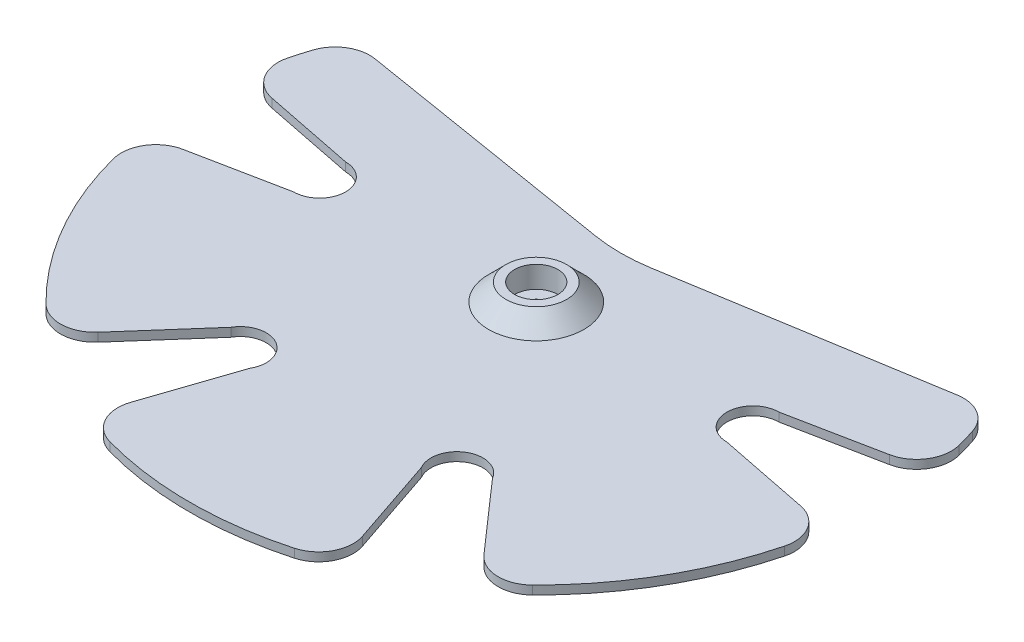
ISO-10303-21;
HEADER;
FILE_DESCRIPTION(('STEP AP214'),'2;1');
FILE_NAME('part.step','',(''),(''),'','','');
FILE_SCHEMA(('AUTOMOTIVE_DESIGN { 1 0 10303 214 1 1 1 1 }'));
ENDSEC;
DATA;
#1=APPLICATION_CONTEXT('core data for automotive mechanical design processes');
#2=APPLICATION_PROTOCOL_DEFINITION('international standard','automotive_design',2000,#1);
#3=PRODUCT_CONTEXT('',#1,'mechanical');
#4=PRODUCT('Part','Part','',(#3));
#5=PRODUCT_RELATED_PRODUCT_CATEGORY('part','',(#4));
#6=PRODUCT_DEFINITION_FORMATION('','',#4);
#7=PRODUCT_DEFINITION_CONTEXT('part definition',#1,'design');
#8=PRODUCT_DEFINITION('design','',#6,#7);
#9=PRODUCT_DEFINITION_SHAPE('','',#8);
#10=(LENGTH_UNIT() NAMED_UNIT(*) SI_UNIT(.MILLI.,.METRE.));
#11=(NAMED_UNIT(*) PLANE_ANGLE_UNIT() SI_UNIT($,.RADIAN.));
#12=(NAMED_UNIT(*) SI_UNIT($,.STERADIAN.) SOLID_ANGLE_UNIT());
#13=UNCERTAINTY_MEASURE_WITH_UNIT(LENGTH_MEASURE(1.E-05),#10,'distance_accuracy_value','');
#14=(GEOMETRIC_REPRESENTATION_CONTEXT(3) GLOBAL_UNCERTAINTY_ASSIGNED_CONTEXT((#13)) GLOBAL_UNIT_ASSIGNED_CONTEXT((#10,
#11,#12)) REPRESENTATION_CONTEXT('',''));
#15=CARTESIAN_POINT('',(0.,0.,0.));
#16=DIRECTION('',(0.,0.,1.));
#17=DIRECTION('',(1.,0.,0.));
#18=AXIS2_PLACEMENT_3D('',#15,#16,#17);
#19=CARTESIAN_POINT('',(0.,-2.,-29.7612520866625));
#20=DIRECTION('',(0.,1.,0.));
#21=DIRECTION('',(0.,0.,1.));
#22=AXIS2_PLACEMENT_3D('',#19,#20,#21);
#23=CYLINDRICAL_SURFACE('',#22,20.);
#24=DIRECTION('',(0.,-1.,0.));
#25=VECTOR('',#24,1.);
#26=CARTESIAN_POINT('',(-3.23120398234031,-2.,-10.0239949108412));
#27=LINE('',#26,#25);
#28=CARTESIAN_POINT('',(-3.23120398234031,1.,-10.0239949108412));
#29=VERTEX_POINT('',#28);
#30=CARTESIAN_POINT('',(-3.2312039823403,0.,-10.0239949108412));
#31=VERTEX_POINT('',#30);
#32=EDGE_CURVE('E464',#29,#31,#27,.T.);
#33=ORIENTED_EDGE('',*,*,#32,.F.);
#34=CARTESIAN_POINT('',(0.,1.,-29.7612520866625));
#35=DIRECTION('',(0.,1.,0.));
#36=DIRECTION('',(0.,0.,1.));
#37=AXIS2_PLACEMENT_3D('',#34,#35,#36);
#38=CIRCLE('',#37,20.);
#39=CARTESIAN_POINT('',(3.23120398234029,1.,-10.0239949108412));
#40=VERTEX_POINT('',#39);
#41=EDGE_CURVE('E55',#29,#40,#38,.T.);
#42=ORIENTED_EDGE('',*,*,#41,.T.);
#43=DIRECTION('',(0.,-1.,0.));
#44=VECTOR('',#43,1.);
#45=CARTESIAN_POINT('',(3.23120398234028,-2.,-10.0239949108412));
#46=LINE('',#45,#44);
#47=CARTESIAN_POINT('',(3.23120398234028,0.,-10.0239949108412));
#48=VERTEX_POINT('',#47);
#49=EDGE_CURVE('E467',#48,#40,#46,.F.);
#50=ORIENTED_EDGE('',*,*,#49,.F.);
#51=CARTESIAN_POINT('',(0.,0.,-29.7612520866625));
#52=DIRECTION('',(0.,1.,0.));
#53=DIRECTION('',(0.,0.,1.));
#54=AXIS2_PLACEMENT_3D('',#51,#52,#53);
#55=CIRCLE('',#54,20.);
#56=EDGE_CURVE('E12',#48,#31,#55,.F.);
#57=ORIENTED_EDGE('',*,*,#56,.T.);
#58=EDGE_LOOP('',(#33,#42,#50,#57));
#59=FACE_BOUND('',#58,.T.);
#60=ADVANCED_FACE('F48',(#59),#23,.F.);
#61=CARTESIAN_POINT('',(34.8443966505238,1.,-9.04809494097898));
#62=DIRECTION('',(0.,-1.,0.));
#63=DIRECTION('',(0.,0.,-1.));
#64=AXIS2_PLACEMENT_3D('',#61,#62,#63);
#65=CYLINDRICAL_SURFACE('',#64,4.);
#66=DIRECTION('',(0.,1.,0.));
#67=VECTOR('',#66,1.);
#68=CARTESIAN_POINT('',(35.6288611910765,1.,-5.1257722382153));
#69=LINE('',#68,#67);
#70=CARTESIAN_POINT('',(35.6288611910765,0.,-5.1257722382153));
#71=VERTEX_POINT('',#70);
#72=CARTESIAN_POINT('',(35.6288611910765,1.,-5.1257722382153));
#73=VERTEX_POINT('',#72);
#74=EDGE_CURVE('E454',#71,#73,#69,.T.);
#75=ORIENTED_EDGE('',*,*,#74,.F.);
#76=CARTESIAN_POINT('',(34.8443966505238,0.,-9.04809494097898));
#77=DIRECTION('',(0.,1.,0.));
#78=DIRECTION('',(0.,0.,1.));
#79=AXIS2_PLACEMENT_3D('',#76,#77,#78);
#80=CIRCLE('',#79,4.);
#81=CARTESIAN_POINT('',(38.7159962783597,0.,-10.05343882331));
#82=VERTEX_POINT('',#81);
#83=EDGE_CURVE('E460',#82,#71,#80,.F.);
#84=ORIENTED_EDGE('',*,*,#83,.F.);
#85=DIRECTION('',(0.,-1.,0.));
#86=VECTOR('',#85,1.);
#87=CARTESIAN_POINT('',(38.7159962783597,1.,-10.05343882331));
#88=LINE('',#87,#86);
#89=CARTESIAN_POINT('',(38.7159962783597,1.,-10.05343882331));
#90=VERTEX_POINT('',#89);
#91=EDGE_CURVE('E457',#90,#82,#88,.T.);
#92=ORIENTED_EDGE('',*,*,#91,.F.);
#93=CARTESIAN_POINT('',(34.8443966505238,1.,-9.04809494097898));
#94=DIRECTION('',(0.,1.,0.));
#95=DIRECTION('',(0.,0.,1.));
#96=AXIS2_PLACEMENT_3D('',#93,#94,#95);
#97=CIRCLE('',#96,4.);
#98=EDGE_CURVE('E462',#73,#90,#97,.T.);
#99=ORIENTED_EDGE('',*,*,#98,.F.);
#100=EDGE_LOOP('',(#75,#84,#92,#99));
#101=FACE_BOUND('',#100,.T.);
#102=ADVANCED_FACE('F512',(#101),#65,.T.);
#103=CARTESIAN_POINT('',(34.8443966505238,1.,9.04809494097898));
#104=DIRECTION('',(0.,-1.,0.));
#105=DIRECTION('',(0.,0.,-1.));
#106=AXIS2_PLACEMENT_3D('',#103,#104,#105);
#107=CYLINDRICAL_SURFACE('',#106,4.);
#108=DIRECTION('',(0.,-1.,0.));
#109=VECTOR('',#108,1.);
#110=CARTESIAN_POINT('',(35.6288611910765,-9.,5.1257722382153));
#111=LINE('',#110,#109);
#112=CARTESIAN_POINT('',(35.6288611910765,1.,5.1257722382153));
#113=VERTEX_POINT('',#112);
#114=CARTESIAN_POINT('',(35.6288611910765,0.,5.1257722382153));
#115=VERTEX_POINT('',#114);
#116=EDGE_CURVE('E444',#113,#115,#111,.T.);
#117=ORIENTED_EDGE('',*,*,#116,.F.);
#118=CARTESIAN_POINT('',(34.8443966505238,1.,9.04809494097898));
#119=DIRECTION('',(0.,1.,0.));
#120=DIRECTION('',(0.,0.,1.));
#121=AXIS2_PLACEMENT_3D('',#118,#119,#120);
#122=CIRCLE('',#121,4.);
#123=CARTESIAN_POINT('',(38.7159962783597,1.,10.05343882331));
#124=VERTEX_POINT('',#123);
#125=EDGE_CURVE('E450',#124,#113,#122,.T.);
#126=ORIENTED_EDGE('',*,*,#125,.F.);
#127=DIRECTION('',(0.,-1.,0.));
#128=VECTOR('',#127,1.);
#129=CARTESIAN_POINT('',(38.7159962783597,1.,10.05343882331));
#130=LINE('',#129,#128);
#131=CARTESIAN_POINT('',(38.7159962783597,0.,10.05343882331));
#132=VERTEX_POINT('',#131);
#133=EDGE_CURVE('E447',#132,#124,#130,.F.);
#134=ORIENTED_EDGE('',*,*,#133,.F.);
#135=CARTESIAN_POINT('',(34.8443966505238,0.,9.04809494097898));
#136=DIRECTION('',(0.,1.,0.));
#137=DIRECTION('',(0.,0.,1.));
#138=AXIS2_PLACEMENT_3D('',#135,#136,#137);
#139=CIRCLE('',#138,4.);
#140=EDGE_CURVE('E452',#115,#132,#139,.F.);
#141=ORIENTED_EDGE('',*,*,#140,.F.);
#142=EDGE_LOOP('',(#117,#126,#134,#141));
#143=FACE_BOUND('',#142,.T.);
#144=ADVANCED_FACE('F516',(#143),#107,.T.);
#145=CARTESIAN_POINT('',(25.2580784000031,1.,25.6520852084056));
#146=DIRECTION('',(0.,-1.,0.));
#147=DIRECTION('',(0.,0.,-1.));
#148=AXIS2_PLACEMENT_3D('',#145,#146,#147);
#149=CYLINDRICAL_SURFACE('',#148,4.);
#150=DIRECTION('',(0.,1.,0.));
#151=VECTOR('',#150,1.);
#152=CARTESIAN_POINT('',(22.2534795678455,1.,28.292612780274));
#153=LINE('',#152,#151);
#154=CARTESIAN_POINT('',(22.2534795678451,0.,28.2926127802736));
#155=VERTEX_POINT('',#154);
#156=CARTESIAN_POINT('',(22.2534795678451,1.,28.2926127802736));
#157=VERTEX_POINT('',#156);
#158=EDGE_CURVE('E434',#155,#157,#153,.T.);
#159=ORIENTED_EDGE('',*,*,#158,.F.);
#160=CARTESIAN_POINT('',(25.2580784000031,0.,25.6520852084056));
#161=DIRECTION('',(0.,1.,0.));
#162=DIRECTION('',(0.,0.,1.));
#163=AXIS2_PLACEMENT_3D('',#160,#161,#162);
#164=CIRCLE('',#163,4.);
#165=CARTESIAN_POINT('',(28.064531555559,0.,28.5023168982284));
#166=VERTEX_POINT('',#165);
#167=EDGE_CURVE('E440',#166,#155,#164,.F.);
#168=ORIENTED_EDGE('',*,*,#167,.F.);
#169=DIRECTION('',(0.,-1.,0.));
#170=VECTOR('',#169,1.);
#171=CARTESIAN_POINT('',(28.064531555559,1.,28.5023168982284));
#172=LINE('',#171,#170);
#173=CARTESIAN_POINT('',(28.064531555559,1.,28.5023168982284));
#174=VERTEX_POINT('',#173);
#175=EDGE_CURVE('E437',#174,#166,#172,.T.);
#176=ORIENTED_EDGE('',*,*,#175,.F.);
#177=CARTESIAN_POINT('',(25.2580784000031,1.,25.6520852084056));
#178=DIRECTION('',(0.,1.,0.));
#179=DIRECTION('',(0.,0.,1.));
#180=AXIS2_PLACEMENT_3D('',#177,#178,#179);
#181=CIRCLE('',#180,4.);
#182=EDGE_CURVE('E442',#157,#174,#181,.T.);
#183=ORIENTED_EDGE('',*,*,#182,.F.);
#184=EDGE_LOOP('',(#159,#168,#176,#183));
#185=FACE_BOUND('',#184,.T.);
#186=ADVANCED_FACE('F680',(#185),#149,.T.);
#187=CARTESIAN_POINT('',(9.58631825052174,1.,34.7001801493842));
#188=DIRECTION('',(0.,-1.,0.));
#189=DIRECTION('',(0.,0.,-1.));
#190=AXIS2_PLACEMENT_3D('',#187,#188,#189);
#191=CYLINDRICAL_SURFACE('',#190,4.);
#192=DIRECTION('',(0.,-1.,0.));
#193=VECTOR('',#192,1.);
#194=CARTESIAN_POINT('',(13.3753816232319,-9.,33.4183850184892));
#195=LINE('',#194,#193);
#196=CARTESIAN_POINT('',(13.3753816232319,1.,33.4183850184892));
#197=VERTEX_POINT('',#196);
#198=CARTESIAN_POINT('',(13.3753816232319,0.,33.4183850184892));
#199=VERTEX_POINT('',#198);
#200=EDGE_CURVE('E426',#197,#199,#195,.T.);
#201=ORIENTED_EDGE('',*,*,#200,.F.);
#202=CARTESIAN_POINT('',(9.58631825052174,1.,34.7001801493842));
#203=DIRECTION('',(0.,1.,0.));
#204=DIRECTION('',(0.,0.,1.));
#205=AXIS2_PLACEMENT_3D('',#202,#203,#204);
#206=CIRCLE('',#205,4.);
#207=CARTESIAN_POINT('',(10.6514647228019,1.,38.5557557215379));
#208=VERTEX_POINT('',#207);
#209=EDGE_CURVE('E267',#208,#197,#206,.T.);
#210=ORIENTED_EDGE('',*,*,#209,.F.);
#211=DIRECTION('',(0.,-1.,0.));
#212=VECTOR('',#211,1.);
#213=CARTESIAN_POINT('',(10.6514647228019,1.,38.5557557215379));
#214=LINE('',#213,#212);
#215=CARTESIAN_POINT('',(10.6514647228019,0.,38.5557557215379));
#216=VERTEX_POINT('',#215);
#217=EDGE_CURVE('E428',#216,#208,#214,.F.);
#218=ORIENTED_EDGE('',*,*,#217,.F.);
#219=CARTESIAN_POINT('',(9.58631825052174,0.,34.7001801493842));
#220=DIRECTION('',(0.,1.,0.));
#221=DIRECTION('',(0.,0.,1.));
#222=AXIS2_PLACEMENT_3D('',#219,#220,#221);
#223=CIRCLE('',#222,4.);
#224=EDGE_CURVE('E432',#199,#216,#223,.F.);
#225=ORIENTED_EDGE('',*,*,#224,.F.);
#226=EDGE_LOOP('',(#201,#210,#218,#225));
#227=FACE_BOUND('',#226,.T.);
#228=ADVANCED_FACE('F676',(#227),#191,.T.);
#229=CARTESIAN_POINT('',(-9.58631825051854,1.,34.700180149385));
#230=DIRECTION('',(0.,-1.,0.));
#231=DIRECTION('',(0.,0.,-1.));
#232=AXIS2_PLACEMENT_3D('',#229,#230,#231);
#233=CYLINDRICAL_SURFACE('',#232,4.);
#234=DIRECTION('',(0.,1.,0.));
#235=VECTOR('',#234,1.);
#236=CARTESIAN_POINT('',(-13.3753816232286,1.,33.4183850184896));
#237=LINE('',#236,#235);
#238=CARTESIAN_POINT('',(-13.3753816232286,0.,33.4183850184896));
#239=VERTEX_POINT('',#238);
#240=CARTESIAN_POINT('',(-13.3753816232286,1.,33.4183850184896));
#241=VERTEX_POINT('',#240);
#242=EDGE_CURVE('E416',#239,#241,#237,.T.);
#243=ORIENTED_EDGE('',*,*,#242,.F.);
#244=CARTESIAN_POINT('',(-9.58631825051854,0.,34.700180149385));
#245=DIRECTION('',(0.,1.,0.));
#246=DIRECTION('',(0.,0.,1.));
#247=AXIS2_PLACEMENT_3D('',#244,#245,#246);
#248=CIRCLE('',#247,4.);
#249=CARTESIAN_POINT('',(-10.6514647227984,0.,38.5557557215389));
#250=VERTEX_POINT('',#249);
#251=EDGE_CURVE('E422',#250,#239,#248,.F.);
#252=ORIENTED_EDGE('',*,*,#251,.F.);
#253=DIRECTION('',(0.,-1.,0.));
#254=VECTOR('',#253,1.);
#255=CARTESIAN_POINT('',(-10.6514647227984,1.,38.5557557215389));
#256=LINE('',#255,#254);
#257=CARTESIAN_POINT('',(-10.6514647227984,1.,38.5557557215389));
#258=VERTEX_POINT('',#257);
#259=EDGE_CURVE('E419',#258,#250,#256,.T.);
#260=ORIENTED_EDGE('',*,*,#259,.F.);
#261=CARTESIAN_POINT('',(-9.58631825051854,1.,34.700180149385));
#262=DIRECTION('',(0.,1.,0.));
#263=DIRECTION('',(0.,0.,1.));
#264=AXIS2_PLACEMENT_3D('',#261,#262,#263);
#265=CIRCLE('',#264,4.);
#266=EDGE_CURVE('E424',#241,#258,#265,.T.);
#267=ORIENTED_EDGE('',*,*,#266,.F.);
#268=EDGE_LOOP('',(#243,#252,#260,#267));
#269=FACE_BOUND('',#268,.T.);
#270=ADVANCED_FACE('F669',(#269),#233,.T.);
#271=CARTESIAN_POINT('',(-25.2580784000008,1.,25.6520852084078));
#272=DIRECTION('',(0.,-1.,0.));
#273=DIRECTION('',(0.,0.,-1.));
#274=AXIS2_PLACEMENT_3D('',#271,#272,#273);
#275=CYLINDRICAL_SURFACE('',#274,4.);
#276=DIRECTION('',(0.,-1.,0.));
#277=VECTOR('',#276,1.);
#278=CARTESIAN_POINT('',(-28.0645315555564,1.,28.5023168982309));
#279=LINE('',#278,#277);
#280=CARTESIAN_POINT('',(-28.0645315555564,0.,28.5023168982309));
#281=VERTEX_POINT('',#280);
#282=CARTESIAN_POINT('',(-28.0645315555564,1.,28.5023168982309));
#283=VERTEX_POINT('',#282);
#284=EDGE_CURVE('E406',#281,#283,#279,.F.);
#285=ORIENTED_EDGE('',*,*,#284,.F.);
#286=CARTESIAN_POINT('',(-25.2580784000008,0.,25.6520852084078));
#287=DIRECTION('',(0.,1.,0.));
#288=DIRECTION('',(0.,0.,1.));
#289=AXIS2_PLACEMENT_3D('',#286,#287,#288);
#290=CIRCLE('',#289,4.);
#291=CARTESIAN_POINT('',(-22.2534795678436,0.,28.2926127802767));
#292=VERTEX_POINT('',#291);
#293=EDGE_CURVE('E412',#292,#281,#290,.F.);
#294=ORIENTED_EDGE('',*,*,#293,.F.);
#295=DIRECTION('',(0.,-1.,0.));
#296=VECTOR('',#295,1.);
#297=CARTESIAN_POINT('',(-22.2534795678436,-9.,28.2926127802767));
#298=LINE('',#297,#296);
#299=CARTESIAN_POINT('',(-22.2534795678436,1.,28.2926127802767));
#300=VERTEX_POINT('',#299);
#301=EDGE_CURVE('E409',#300,#292,#298,.T.);
#302=ORIENTED_EDGE('',*,*,#301,.F.);
#303=CARTESIAN_POINT('',(-25.2580784000008,1.,25.6520852084078));
#304=DIRECTION('',(0.,1.,0.));
#305=DIRECTION('',(0.,0.,1.));
#306=AXIS2_PLACEMENT_3D('',#303,#304,#305);
#307=CIRCLE('',#306,4.);
#308=EDGE_CURVE('E414',#283,#300,#307,.T.);
#309=ORIENTED_EDGE('',*,*,#308,.F.);
#310=EDGE_LOOP('',(#285,#294,#302,#309));
#311=FACE_BOUND('',#310,.T.);
#312=ADVANCED_FACE('F662',(#311),#275,.T.);
#313=CARTESIAN_POINT('',(-34.844396650523,1.,9.04809494098188));
#314=DIRECTION('',(0.,-1.,0.));
#315=DIRECTION('',(0.,0.,-1.));
#316=AXIS2_PLACEMENT_3D('',#313,#314,#315);
#317=CYLINDRICAL_SURFACE('',#316,4.);
#318=DIRECTION('',(0.,1.,0.));
#319=VECTOR('',#318,1.);
#320=CARTESIAN_POINT('',(-35.6288611910752,1.,5.1257722382181));
#321=LINE('',#320,#319);
#322=CARTESIAN_POINT('',(-35.6288611910753,0.,5.1257722382181));
#323=VERTEX_POINT('',#322);
#324=CARTESIAN_POINT('',(-35.6288611910752,1.,5.1257722382181));
#325=VERTEX_POINT('',#324);
#326=EDGE_CURVE('E396',#323,#325,#321,.T.);
#327=ORIENTED_EDGE('',*,*,#326,.F.);
#328=CARTESIAN_POINT('',(-34.844396650523,0.,9.04809494098188));
#329=DIRECTION('',(0.,1.,0.));
#330=DIRECTION('',(0.,0.,1.));
#331=AXIS2_PLACEMENT_3D('',#328,#329,#330);
#332=CIRCLE('',#331,4.);
#333=CARTESIAN_POINT('',(-38.7159962783589,0.,10.0534388233132));
#334=VERTEX_POINT('',#333);
#335=EDGE_CURVE('E402',#334,#323,#332,.F.);
#336=ORIENTED_EDGE('',*,*,#335,.F.);
#337=DIRECTION('',(0.,-1.,0.));
#338=VECTOR('',#337,1.);
#339=CARTESIAN_POINT('',(-38.7159962783589,1.,10.0534388233132));
#340=LINE('',#339,#338);
#341=CARTESIAN_POINT('',(-38.7159962783589,1.,10.0534388233132));
#342=VERTEX_POINT('',#341);
#343=EDGE_CURVE('E399',#342,#334,#340,.T.);
#344=ORIENTED_EDGE('',*,*,#343,.F.);
#345=CARTESIAN_POINT('',(-34.844396650523,1.,9.04809494098188));
#346=DIRECTION('',(0.,1.,0.));
#347=DIRECTION('',(0.,0.,1.));
#348=AXIS2_PLACEMENT_3D('',#345,#346,#347);
#349=CIRCLE('',#348,4.);
#350=EDGE_CURVE('E404',#325,#342,#349,.T.);
#351=ORIENTED_EDGE('',*,*,#350,.F.);
#352=EDGE_LOOP('',(#327,#336,#344,#351));
#353=FACE_BOUND('',#352,.T.);
#354=ADVANCED_FACE('F660',(#353),#317,.T.);
#355=CARTESIAN_POINT('',(-34.8443966505245,1.,-9.04809494097625));
#356=DIRECTION('',(0.,-1.,0.));
#357=DIRECTION('',(0.,0.,-1.));
#358=AXIS2_PLACEMENT_3D('',#355,#356,#357);
#359=CYLINDRICAL_SURFACE('',#358,4.);
#360=DIRECTION('',(0.,-1.,0.));
#361=VECTOR('',#360,1.);
#362=CARTESIAN_POINT('',(-38.7159962783605,1.,-10.0534388233069));
#363=LINE('',#362,#361);
#364=CARTESIAN_POINT('',(-38.7159962783605,0.,-10.053438823307));
#365=VERTEX_POINT('',#364);
#366=CARTESIAN_POINT('',(-38.7159962783605,1.,-10.053438823307));
#367=VERTEX_POINT('',#366);
#368=EDGE_CURVE('E386',#365,#367,#363,.F.);
#369=ORIENTED_EDGE('',*,*,#368,.F.);
#370=CARTESIAN_POINT('',(-34.8443966505245,0.,-9.04809494097625));
#371=DIRECTION('',(0.,1.,0.));
#372=DIRECTION('',(0.,0.,1.));
#373=AXIS2_PLACEMENT_3D('',#370,#371,#372);
#374=CIRCLE('',#373,4.);
#375=CARTESIAN_POINT('',(-35.6288611910777,0.,-5.12577223821266));
#376=VERTEX_POINT('',#375);
#377=EDGE_CURVE('E392',#376,#365,#374,.F.);
#378=ORIENTED_EDGE('',*,*,#377,.F.);
#379=DIRECTION('',(0.,-1.,0.));
#380=VECTOR('',#379,1.);
#381=CARTESIAN_POINT('',(-35.6288611910777,-9.,-5.12577223821266));
#382=LINE('',#381,#380);
#383=CARTESIAN_POINT('',(-35.6288611910771,1.,-5.12577223821255));
#384=VERTEX_POINT('',#383);
#385=EDGE_CURVE('E389',#384,#376,#382,.T.);
#386=ORIENTED_EDGE('',*,*,#385,.F.);
#387=CARTESIAN_POINT('',(-34.8443966505245,1.,-9.04809494097625));
#388=DIRECTION('',(0.,1.,0.));
#389=DIRECTION('',(0.,0.,1.));
#390=AXIS2_PLACEMENT_3D('',#387,#388,#389);
#391=CIRCLE('',#390,4.);
#392=EDGE_CURVE('E394',#367,#384,#391,.T.);
#393=ORIENTED_EDGE('',*,*,#392,.F.);
#394=EDGE_LOOP('',(#369,#378,#386,#393));
#395=FACE_BOUND('',#394,.T.);
#396=ADVANCED_FACE('F652',(#395),#359,.T.);
#397=CARTESIAN_POINT('',(-34.2619251207725,1.,-11.0508138622718));
#398=DIRECTION('',(0.,-1.,0.));
#399=DIRECTION('',(0.,0.,-1.));
#400=AXIS2_PLACEMENT_3D('',#397,#398,#399);
#401=CYLINDRICAL_SURFACE('',#400,4.);
#402=DIRECTION('',(0.,-1.,0.));
#403=VECTOR('',#402,1.);
#404=CARTESIAN_POINT('',(-33.6156843243044,-2.,-14.9982652974361));
#405=LINE('',#404,#403);
#406=CARTESIAN_POINT('',(-33.6156843243044,0.,-14.9982652974361));
#407=VERTEX_POINT('',#406);
#408=CARTESIAN_POINT('',(-33.6156843243044,1.,-14.9982652974361));
#409=VERTEX_POINT('',#408);
#410=EDGE_CURVE('E376',#407,#409,#405,.F.);
#411=ORIENTED_EDGE('',*,*,#410,.F.);
#412=CARTESIAN_POINT('',(-34.2619251207725,0.,-11.0508138622718));
#413=DIRECTION('',(0.,1.,0.));
#414=DIRECTION('',(0.,0.,1.));
#415=AXIS2_PLACEMENT_3D('',#412,#413,#414);
#416=CIRCLE('',#415,4.);
#417=CARTESIAN_POINT('',(-38.0688056897472,0.,-12.2786820691909));
#418=VERTEX_POINT('',#417);
#419=EDGE_CURVE('E382',#418,#407,#416,.F.);
#420=ORIENTED_EDGE('',*,*,#419,.F.);
#421=DIRECTION('',(0.,-1.,0.));
#422=VECTOR('',#421,1.);
#423=CARTESIAN_POINT('',(-38.0688056897472,1.,-12.2786820691909));
#424=LINE('',#423,#422);
#425=CARTESIAN_POINT('',(-38.0688056897472,1.,-12.2786820691909));
#426=VERTEX_POINT('',#425);
#427=EDGE_CURVE('E379',#426,#418,#424,.T.);
#428=ORIENTED_EDGE('',*,*,#427,.F.);
#429=CARTESIAN_POINT('',(-34.2619251207725,1.,-11.0508138622718));
#430=DIRECTION('',(0.,1.,0.));
#431=DIRECTION('',(0.,0.,1.));
#432=AXIS2_PLACEMENT_3D('',#429,#430,#431);
#433=CIRCLE('',#432,4.);
#434=EDGE_CURVE('E384',#409,#426,#433,.T.);
#435=ORIENTED_EDGE('',*,*,#434,.F.);
#436=EDGE_LOOP('',(#411,#420,#428,#435));
#437=FACE_BOUND('',#436,.T.);
#438=ADVANCED_FACE('F525',(#437),#401,.T.);
#439=CARTESIAN_POINT('',(34.2619251207725,1.,-11.0508138622718));
#440=DIRECTION('',(0.,-1.,0.));
#441=DIRECTION('',(0.,0.,-1.));
#442=AXIS2_PLACEMENT_3D('',#439,#440,#441);
#443=CYLINDRICAL_SURFACE('',#442,4.);
#444=DIRECTION('',(0.,-1.,0.));
#445=VECTOR('',#444,1.);
#446=CARTESIAN_POINT('',(33.6156843243044,-2.,-14.9982652974361));
#447=LINE('',#446,#445);
#448=CARTESIAN_POINT('',(33.6156843243044,1.,-14.9982652974361));
#449=VERTEX_POINT('',#448);
#450=CARTESIAN_POINT('',(33.6156843243044,0.,-14.9982652974361));
#451=VERTEX_POINT('',#450);
#452=EDGE_CURVE('E364',#449,#451,#447,.T.);
#453=ORIENTED_EDGE('',*,*,#452,.F.);
#454=CARTESIAN_POINT('',(34.2619251207725,1.,-11.0508138622718));
#455=DIRECTION('',(0.,1.,0.));
#456=DIRECTION('',(0.,0.,1.));
#457=AXIS2_PLACEMENT_3D('',#454,#455,#456);
#458=CIRCLE('',#457,4.);
#459=CARTESIAN_POINT('',(38.0688056897472,1.,-12.2786820691909));
#460=VERTEX_POINT('',#459);
#461=EDGE_CURVE('E370',#460,#449,#458,.T.);
#462=ORIENTED_EDGE('',*,*,#461,.F.);
#463=DIRECTION('',(0.,-1.,0.));
#464=VECTOR('',#463,1.);
#465=CARTESIAN_POINT('',(38.0688056897472,1.,-12.2786820691909));
#466=LINE('',#465,#464);
#467=CARTESIAN_POINT('',(38.0688056897472,0.,-12.2786820691909));
#468=VERTEX_POINT('',#467);
#469=EDGE_CURVE('E367',#468,#460,#466,.F.);
#470=ORIENTED_EDGE('',*,*,#469,.F.);
#471=CARTESIAN_POINT('',(34.2619251207725,0.,-11.0508138622718));
#472=DIRECTION('',(0.,1.,0.));
#473=DIRECTION('',(0.,0.,1.));
#474=AXIS2_PLACEMENT_3D('',#471,#472,#473);
#475=CIRCLE('',#474,4.);
#476=EDGE_CURVE('E373',#451,#468,#475,.F.);
#477=ORIENTED_EDGE('',*,*,#476,.F.);
#478=EDGE_LOOP('',(#453,#462,#470,#477));
#479=FACE_BOUND('',#478,.T.);
#480=ADVANCED_FACE('F561',(#479),#443,.T.);
#481=CARTESIAN_POINT('',(0.,1.,0.));
#482=DIRECTION('',(0.,-1.,0.));
#483=DIRECTION('',(0.,0.,-1.));
#484=AXIS2_PLACEMENT_3D('',#481,#482,#483);
#485=CYLINDRICAL_SURFACE('',#484,40.);
#486=CARTESIAN_POINT('',(0.,1.,0.));
#487=DIRECTION('',(0.,1.,0.));
#488=DIRECTION('',(0.,0.,1.));
#489=AXIS2_PLACEMENT_3D('',#486,#487,#488);
#490=CIRCLE('',#489,40.);
#491=EDGE_CURVE('E316',#90,#460,#490,.T.);
#492=ORIENTED_EDGE('',*,*,#491,.F.);
#493=ORIENTED_EDGE('',*,*,#91,.T.);
#494=CARTESIAN_POINT('',(0.,0.,0.));
#495=DIRECTION('',(0.,1.,0.));
#496=DIRECTION('',(0.,0.,1.));
#497=AXIS2_PLACEMENT_3D('',#494,#495,#496);
#498=CIRCLE('',#497,40.);
#499=EDGE_CURVE('E323',#82,#468,#498,.T.);
#500=ORIENTED_EDGE('',*,*,#499,.T.);
#501=ORIENTED_EDGE('',*,*,#469,.T.);
#502=EDGE_LOOP('',(#492,#493,#500,#501));
#503=FACE_BOUND('',#502,.T.);
#504=ADVANCED_FACE('F563',(#503),#485,.T.);
#505=EDGE_CURVE('E322',#166,#132,#498,.T.);
#506=ORIENTED_EDGE('',*,*,#505,.T.);
#507=ORIENTED_EDGE('',*,*,#133,.T.);
#508=EDGE_CURVE('E315',#174,#124,#490,.T.);
#509=ORIENTED_EDGE('',*,*,#508,.F.);
#510=ORIENTED_EDGE('',*,*,#175,.T.);
#511=EDGE_LOOP('',(#506,#507,#509,#510));
#512=FACE_BOUND('',#511,.T.);
#513=ADVANCED_FACE('F540',(#512),#485,.T.);
#514=EDGE_CURVE('E310',#334,#281,#498,.T.);
#515=ORIENTED_EDGE('',*,*,#514,.T.);
#516=ORIENTED_EDGE('',*,*,#284,.T.);
#517=EDGE_CURVE('E321',#342,#283,#490,.T.);
#518=ORIENTED_EDGE('',*,*,#517,.F.);
#519=ORIENTED_EDGE('',*,*,#343,.T.);
#520=EDGE_LOOP('',(#515,#516,#518,#519));
#521=FACE_BOUND('',#520,.T.);
#522=ADVANCED_FACE('F637',(#521),#485,.T.);
#523=EDGE_CURVE('E324',#418,#365,#498,.T.);
#524=ORIENTED_EDGE('',*,*,#523,.T.);
#525=ORIENTED_EDGE('',*,*,#368,.T.);
#526=EDGE_CURVE('E317',#426,#367,#490,.T.);
#527=ORIENTED_EDGE('',*,*,#526,.F.);
#528=ORIENTED_EDGE('',*,*,#427,.T.);
#529=EDGE_LOOP('',(#524,#525,#527,#528));
#530=FACE_BOUND('',#529,.T.);
#531=ADVANCED_FACE('F529',(#530),#485,.T.);
#532=CARTESIAN_POINT('',(0.,1.,0.));
#533=DIRECTION('',(0.,1.,0.));
#534=DIRECTION('',(0.,0.,1.));
#535=AXIS2_PLACEMENT_3D('',#532,#533,#534);
#536=PLANE('',#535);
#537=DIRECTION('',(0.98058067569092,0.,-0.196116135138184));
#538=VECTOR('',#537,1.);
#539=CARTESIAN_POINT('',(0.384615384615383,1.,1.92307692307692));
#540=LINE('',#539,#538);
#541=CARTESIAN_POINT('',(25.,1.,-3.));
#542=VERTEX_POINT('',#541);
#543=EDGE_CURVE('E295',#542,#73,#540,.T.);
#544=ORIENTED_EDGE('',*,*,#543,.T.);
#545=ORIENTED_EDGE('',*,*,#98,.T.);
#546=ORIENTED_EDGE('',*,*,#491,.T.);
#547=ORIENTED_EDGE('',*,*,#461,.T.);
#548=DIRECTION('',(0.986862858791064,0.,-0.161560199117015));
#549=VECTOR('',#548,1.);
#550=CARTESIAN_POINT('',(0.,1.,-9.49501162392929));
#551=LINE('',#550,#549);
#552=EDGE_CURVE('E472',#40,#449,#551,.T.);
#553=ORIENTED_EDGE('',*,*,#552,.F.);
#554=ORIENTED_EDGE('',*,*,#41,.F.);
#555=DIRECTION('',(0.986862858791063,0.,0.161560199117015));
#556=VECTOR('',#555,1.);
#557=CARTESIAN_POINT('',(-36.8622623308655,1.,-15.5297654795703));
#558=LINE('',#557,#556);
#559=EDGE_CURVE('E477',#409,#29,#558,.T.);
#560=ORIENTED_EDGE('',*,*,#559,.F.);
#561=ORIENTED_EDGE('',*,*,#434,.T.);
#562=ORIENTED_EDGE('',*,*,#526,.T.);
#563=ORIENTED_EDGE('',*,*,#392,.T.);
#564=DIRECTION('',(-0.980580675690895,0.,-0.196116135138308));
#565=VECTOR('',#564,1.);
#566=CARTESIAN_POINT('',(-0.384615384617074,1.,1.9230769230841));
#567=LINE('',#566,#565);
#568=CARTESIAN_POINT('',(-24.9999999999992,1.,-2.9999999999951));
#569=VERTEX_POINT('',#568);
#570=EDGE_CURVE('E276',#569,#384,#567,.T.);
#571=ORIENTED_EDGE('',*,*,#570,.F.);
#572=CARTESIAN_POINT('',(-24.9999999999996,1.,4.44006909862254E-12));
#573=DIRECTION('',(0.,1.,0.));
#574=DIRECTION('',(0.,0.,1.));
#575=AXIS2_PLACEMENT_3D('',#572,#573,#574);
#576=CIRCLE('',#575,2.99999999999907);
#577=CARTESIAN_POINT('',(-24.9999999999998,1.,3.00000000000398));
#578=VERTEX_POINT('',#577);
#579=EDGE_CURVE('E282',#578,#569,#576,.T.);
#580=ORIENTED_EDGE('',*,*,#579,.F.);
#581=DIRECTION('',(-0.980580675690945,0.,0.196116135138059));
#582=VECTOR('',#581,1.);
#583=CARTESIAN_POINT('',(-0.384615384613657,1.,-1.92307692306956));
#584=LINE('',#583,#582);
#585=EDGE_CURVE('E252',#578,#325,#584,.T.);
#586=ORIENTED_EDGE('',*,*,#585,.T.);
#587=ORIENTED_EDGE('',*,*,#350,.T.);
#588=ORIENTED_EDGE('',*,*,#517,.T.);
#589=ORIENTED_EDGE('',*,*,#308,.T.);
#590=DIRECTION('',(-0.660131892967213,0.,0.751149708039299));
#591=VECTOR('',#590,1.);
#592=CARTESIAN_POINT('',(1.4731257765132,1.,1.29462515530603));
#593=LINE('',#592,#591);
#594=CARTESIAN_POINT('',(-15.0980762113497,1.,20.1506350946162));
#595=VERTEX_POINT('',#594);
#596=EDGE_CURVE('E304',#595,#300,#593,.T.);
#597=ORIENTED_EDGE('',*,*,#596,.F.);
#598=CARTESIAN_POINT('',(-12.4999999999982,1.,21.6506350946154));
#599=DIRECTION('',(0.,1.,0.));
#600=DIRECTION('',(0.,0.,1.));
#601=AXIS2_PLACEMENT_3D('',#598,#599,#600);
#602=CIRCLE('',#601,2.99999999999602);
#603=CARTESIAN_POINT('',(-9.90192378864674,1.,23.1506350946147));
#604=VERTEX_POINT('',#603);
#605=EDGE_CURVE('E301',#604,#595,#602,.T.);
#606=ORIENTED_EDGE('',*,*,#605,.F.);
#607=DIRECTION('',(-0.320448782723851,0.,0.947265843177512));
#608=VECTOR('',#607,1.);
#609=CARTESIAN_POINT('',(-1.85774116111893,1.,-0.628451767773705));
#610=LINE('',#609,#608);
#611=EDGE_CURVE('E273',#604,#241,#610,.T.);
#612=ORIENTED_EDGE('',*,*,#611,.T.);
#613=ORIENTED_EDGE('',*,*,#266,.T.);
#614=EDGE_CURVE('E312',#258,#208,#490,.T.);
#615=ORIENTED_EDGE('',*,*,#614,.T.);
#616=ORIENTED_EDGE('',*,*,#209,.T.);
#617=DIRECTION('',(0.320448782723731,0.,0.947265843177552));
#618=VECTOR('',#617,1.);
#619=CARTESIAN_POINT('',(1.85774116112648,1.,-0.628451767775994));
#620=LINE('',#619,#618);
#621=CARTESIAN_POINT('',(9.90192378865057,1.,23.1506350946123));
#622=VERTEX_POINT('',#621);
#623=EDGE_CURVE('E246',#622,#197,#620,.T.);
#624=ORIENTED_EDGE('',*,*,#623,.F.);
#625=CARTESIAN_POINT('',(12.5000000000025,1.,21.6506350946132));
#626=DIRECTION('',(0.,1.,0.));
#627=DIRECTION('',(0.,0.,1.));
#628=AXIS2_PLACEMENT_3D('',#625,#626,#627);
#629=CIRCLE('',#628,2.99999999999663);
#630=CARTESIAN_POINT('',(15.0980762113544,1.,20.1506350946142));
#631=VERTEX_POINT('',#630);
#632=EDGE_CURVE('E255',#631,#622,#629,.T.);
#633=ORIENTED_EDGE('',*,*,#632,.F.);
#634=DIRECTION('',(0.660131892967118,0.,0.751149708039383));
#635=VECTOR('',#634,1.);
#636=CARTESIAN_POINT('',(-1.47312577650752,1.,1.2946251553007));
#637=LINE('',#636,#635);
#638=EDGE_CURVE('E261',#631,#157,#637,.T.);
#639=ORIENTED_EDGE('',*,*,#638,.T.);
#640=ORIENTED_EDGE('',*,*,#182,.T.);
#641=ORIENTED_EDGE('',*,*,#508,.T.);
#642=ORIENTED_EDGE('',*,*,#125,.T.);
#643=DIRECTION('',(0.98058067569092,0.,0.196116135138184));
#644=VECTOR('',#643,1.);
#645=CARTESIAN_POINT('',(0.384615384615383,1.,-1.92307692307692));
#646=LINE('',#645,#644);
#647=CARTESIAN_POINT('',(25.,1.,3.));
#648=VERTEX_POINT('',#647);
#649=EDGE_CURVE('E279',#648,#113,#646,.T.);
#650=ORIENTED_EDGE('',*,*,#649,.F.);
#651=CARTESIAN_POINT('',(25.,1.,0.));
#652=DIRECTION('',(0.,1.,0.));
#653=DIRECTION('',(0.,0.,1.));
#654=AXIS2_PLACEMENT_3D('',#651,#652,#653);
#655=CIRCLE('',#654,3.);
#656=EDGE_CURVE('E289',#542,#648,#655,.T.);
#657=ORIENTED_EDGE('',*,*,#656,.F.);
#658=EDGE_LOOP('',(#544,#545,#546,#547,#553,#554,#560,#561,#562,#563,#571,#580,#586,#587,#588,
#589,#597,#606,#612,#613,#615,#616,#624,#633,#639,#640,#641,#642,#650,#657));
#659=FACE_BOUND('',#658,.T.);
#660=CARTESIAN_POINT('',(0.,1.,0.));
#661=DIRECTION('',(0.,1.,0.));
#662=DIRECTION('',(0.,0.,1.));
#663=AXIS2_PLACEMENT_3D('',#660,#661,#662);
#664=CIRCLE('',#663,5.50000000000001);
#665=CARTESIAN_POINT('',(0.,1.,5.50000000000001));
#666=VERTEX_POINT('',#665);
#667=EDGE_CURVE('E357',#666,#666,#664,.F.);
#668=ORIENTED_EDGE('',*,*,#667,.T.);
#669=EDGE_LOOP('',(#668));
#670=FACE_BOUND('',#669,.T.);
#671=ADVANCED_FACE('F264',(#659,#670),#536,.T.);
#672=CARTESIAN_POINT('',(0.,0.,0.));
#673=DIRECTION('',(0.,1.,0.));
#674=DIRECTION('',(0.,0.,1.));
#675=AXIS2_PLACEMENT_3D('',#672,#673,#674);
#676=PLANE('',#675);
#677=ORIENTED_EDGE('',*,*,#56,.F.);
#678=DIRECTION('',(0.986862858791064,0.,-0.161560199117015));
#679=VECTOR('',#678,1.);
#680=CARTESIAN_POINT('',(-1.51386338418438,0.,-9.24717569859677));
#681=LINE('',#680,#679);
#682=EDGE_CURVE('E362',#48,#451,#681,.T.);
#683=ORIENTED_EDGE('',*,*,#682,.T.);
#684=ORIENTED_EDGE('',*,*,#476,.T.);
#685=ORIENTED_EDGE('',*,*,#499,.F.);
#686=ORIENTED_EDGE('',*,*,#83,.T.);
#687=DIRECTION('',(0.98058067569092,0.,-0.196116135138184));
#688=VECTOR('',#687,1.);
#689=CARTESIAN_POINT('',(0.384615384615383,0.,1.92307692307692));
#690=LINE('',#689,#688);
#691=CARTESIAN_POINT('',(25.,0.,-3.));
#692=VERTEX_POINT('',#691);
#693=EDGE_CURVE('E339',#692,#71,#690,.T.);
#694=ORIENTED_EDGE('',*,*,#693,.F.);
#695=CARTESIAN_POINT('',(25.,0.,0.));
#696=DIRECTION('',(0.,1.,0.));
#697=DIRECTION('',(0.,0.,1.));
#698=AXIS2_PLACEMENT_3D('',#695,#696,#697);
#699=CIRCLE('',#698,3.);
#700=CARTESIAN_POINT('',(25.,0.,3.));
#701=VERTEX_POINT('',#700);
#702=EDGE_CURVE('E336',#692,#701,#699,.T.);
#703=ORIENTED_EDGE('',*,*,#702,.T.);
#704=DIRECTION('',(0.98058067569092,0.,0.196116135138184));
#705=VECTOR('',#704,1.);
#706=CARTESIAN_POINT('',(0.384615384615383,0.,-1.92307692307692));
#707=LINE('',#706,#705);
#708=EDGE_CURVE('E333',#701,#115,#707,.T.);
#709=ORIENTED_EDGE('',*,*,#708,.T.);
#710=ORIENTED_EDGE('',*,*,#140,.T.);
#711=ORIENTED_EDGE('',*,*,#505,.F.);
#712=ORIENTED_EDGE('',*,*,#167,.T.);
#713=DIRECTION('',(0.660131892967118,0.,0.751149708039383));
#714=VECTOR('',#713,1.);
#715=CARTESIAN_POINT('',(-1.47312577650752,0.,1.2946251553007));
#716=LINE('',#715,#714);
#717=CARTESIAN_POINT('',(15.0980762113544,0.,20.1506350946142));
#718=VERTEX_POINT('',#717);
#719=EDGE_CURVE('E354',#718,#155,#716,.T.);
#720=ORIENTED_EDGE('',*,*,#719,.F.);
#721=CARTESIAN_POINT('',(12.5000000000025,0.,21.6506350946132));
#722=DIRECTION('',(0.,1.,0.));
#723=DIRECTION('',(0.,0.,1.));
#724=AXIS2_PLACEMENT_3D('',#721,#722,#723);
#725=CIRCLE('',#724,2.99999999999663);
#726=CARTESIAN_POINT('',(9.90192378865203,0.,23.1506350946114));
#727=VERTEX_POINT('',#726);
#728=EDGE_CURVE('E351',#718,#727,#725,.T.);
#729=ORIENTED_EDGE('',*,*,#728,.T.);
#730=DIRECTION('',(0.320448782723731,0.,0.947265843177552));
#731=VECTOR('',#730,1.);
#732=CARTESIAN_POINT('',(1.85774116112648,0.,-0.628451767775994));
#733=LINE('',#732,#731);
#734=EDGE_CURVE('E248',#727,#199,#733,.T.);
#735=ORIENTED_EDGE('',*,*,#734,.T.);
#736=ORIENTED_EDGE('',*,*,#224,.T.);
#737=EDGE_CURVE('E318',#250,#216,#498,.T.);
#738=ORIENTED_EDGE('',*,*,#737,.F.);
#739=ORIENTED_EDGE('',*,*,#251,.T.);
#740=DIRECTION('',(-0.320448782723851,0.,0.947265843177512));
#741=VECTOR('',#740,1.);
#742=CARTESIAN_POINT('',(-1.85774116111893,0.,-0.628451767773705));
#743=LINE('',#742,#741);
#744=CARTESIAN_POINT('',(-9.90192378864674,0.,23.1506350946147));
#745=VERTEX_POINT('',#744);
#746=EDGE_CURVE('E330',#745,#239,#743,.T.);
#747=ORIENTED_EDGE('',*,*,#746,.F.);
#748=CARTESIAN_POINT('',(-12.4999999999982,0.,21.6506350946154));
#749=DIRECTION('',(0.,1.,0.));
#750=DIRECTION('',(0.,0.,1.));
#751=AXIS2_PLACEMENT_3D('',#748,#749,#750);
#752=CIRCLE('',#751,2.99999999999602);
#753=CARTESIAN_POINT('',(-15.098076211348,0.,20.1506350946172));
#754=VERTEX_POINT('',#753);
#755=EDGE_CURVE('E314',#745,#754,#752,.T.);
#756=ORIENTED_EDGE('',*,*,#755,.T.);
#757=DIRECTION('',(-0.660131892967213,0.,0.751149708039299));
#758=VECTOR('',#757,1.);
#759=CARTESIAN_POINT('',(1.4731257765132,0.,1.29462515530603));
#760=LINE('',#759,#758);
#761=EDGE_CURVE('E327',#754,#292,#760,.T.);
#762=ORIENTED_EDGE('',*,*,#761,.T.);
#763=ORIENTED_EDGE('',*,*,#293,.T.);
#764=ORIENTED_EDGE('',*,*,#514,.F.);
#765=ORIENTED_EDGE('',*,*,#335,.T.);
#766=DIRECTION('',(-0.980580675690945,0.,0.196116135138059));
#767=VECTOR('',#766,1.);
#768=CARTESIAN_POINT('',(-0.384615384613657,0.,-1.92307692306956));
#769=LINE('',#768,#767);
#770=CARTESIAN_POINT('',(-24.9999999999998,0.,3.00000000000398));
#771=VERTEX_POINT('',#770);
#772=EDGE_CURVE('E348',#771,#323,#769,.T.);
#773=ORIENTED_EDGE('',*,*,#772,.F.);
#774=CARTESIAN_POINT('',(-24.9999999999996,0.,4.44006909862254E-12));
#775=DIRECTION('',(0.,1.,0.));
#776=DIRECTION('',(0.,0.,1.));
#777=AXIS2_PLACEMENT_3D('',#774,#775,#776);
#778=CIRCLE('',#777,2.99999999999907);
#779=CARTESIAN_POINT('',(-24.9999999999992,0.,-2.99999999999463));
#780=VERTEX_POINT('',#779);
#781=EDGE_CURVE('E342',#771,#780,#778,.T.);
#782=ORIENTED_EDGE('',*,*,#781,.T.);
#783=DIRECTION('',(-0.980580675690895,0.,-0.196116135138308));
#784=VECTOR('',#783,1.);
#785=CARTESIAN_POINT('',(-0.384615384617074,0.,1.9230769230841));
#786=LINE('',#785,#784);
#787=EDGE_CURVE('E345',#780,#376,#786,.T.);
#788=ORIENTED_EDGE('',*,*,#787,.T.);
#789=ORIENTED_EDGE('',*,*,#377,.T.);
#790=ORIENTED_EDGE('',*,*,#523,.F.);
#791=ORIENTED_EDGE('',*,*,#419,.T.);
#792=DIRECTION('',(0.986862858791064,0.,0.161560199117015));
#793=VECTOR('',#792,1.);
#794=CARTESIAN_POINT('',(1.51386338418438,0.,-9.24717569859676));
#795=LINE('',#794,#793);
#796=EDGE_CURVE('E360',#407,#31,#795,.T.);
#797=ORIENTED_EDGE('',*,*,#796,.T.);
#798=EDGE_LOOP('',(#677,#683,#684,#685,#686,#694,#703,#709,#710,#711,#712,#720,#729,#735,#736,
#738,#739,#747,#756,#762,#763,#764,#765,#773,#782,#788,#789,#790,#791,#797));
#799=FACE_BOUND('',#798,.T.);
#800=CARTESIAN_POINT('',(0.,0.,0.));
#801=DIRECTION('',(0.,1.,0.));
#802=DIRECTION('',(0.,0.,1.));
#803=AXIS2_PLACEMENT_3D('',#800,#801,#802);
#804=CIRCLE('',#803,1.1);
#805=CARTESIAN_POINT('',(0.,0.,1.1));
#806=VERTEX_POINT('',#805);
#807=EDGE_CURVE('E483',#806,#806,#804,.T.);
#808=ORIENTED_EDGE('',*,*,#807,.T.);
#809=EDGE_LOOP('',(#808));
#810=FACE_BOUND('',#809,.T.);
#811=ADVANCED_FACE('F565',(#799,#810),#676,.F.);
#812=ORIENTED_EDGE('',*,*,#737,.T.);
#813=ORIENTED_EDGE('',*,*,#217,.T.);
#814=ORIENTED_EDGE('',*,*,#614,.F.);
#815=ORIENTED_EDGE('',*,*,#259,.T.);
#816=EDGE_LOOP('',(#812,#813,#814,#815));
#817=FACE_BOUND('',#816,.T.);
#818=ADVANCED_FACE('F568',(#817),#485,.T.);
#819=CARTESIAN_POINT('',(-1.85774116111893,-9.,-0.628451767773705));
#820=DIRECTION('',(-0.947265843177512,0.,-0.320448782723851));
#821=DIRECTION('',(-0.320448782723851,0.,0.947265843177512));
#822=AXIS2_PLACEMENT_3D('',#819,#820,#821);
#823=PLANE('',#822);
#824=ORIENTED_EDGE('',*,*,#746,.T.);
#825=ORIENTED_EDGE('',*,*,#242,.T.);
#826=ORIENTED_EDGE('',*,*,#611,.F.);
#827=DIRECTION('',(0.,1.,0.));
#828=VECTOR('',#827,1.);
#829=CARTESIAN_POINT('',(-9.90192378864674,-9.,23.1506350946147));
#830=LINE('',#829,#828);
#831=EDGE_CURVE('E307',#745,#604,#830,.T.);
#832=ORIENTED_EDGE('',*,*,#831,.F.);
#833=EDGE_LOOP('',(#824,#825,#826,#832));
#834=FACE_BOUND('',#833,.T.);
#835=ADVANCED_FACE('F622',(#834),#823,.T.);
#836=CARTESIAN_POINT('',(1.4731257765132,-9.,1.29462515530603));
#837=DIRECTION('',(-0.751149708039299,0.,-0.660131892967213));
#838=DIRECTION('',(-0.660131892967213,0.,0.751149708039299));
#839=AXIS2_PLACEMENT_3D('',#836,#837,#838);
#840=PLANE('',#839);
#841=ORIENTED_EDGE('',*,*,#596,.T.);
#842=ORIENTED_EDGE('',*,*,#301,.T.);
#843=ORIENTED_EDGE('',*,*,#761,.F.);
#844=DIRECTION('',(0.,1.,0.));
#845=VECTOR('',#844,1.);
#846=CARTESIAN_POINT('',(-15.0980762113497,-9.,20.1506350946162));
#847=LINE('',#846,#845);
#848=EDGE_CURVE('E308',#754,#595,#847,.T.);
#849=ORIENTED_EDGE('',*,*,#848,.T.);
#850=EDGE_LOOP('',(#841,#842,#843,#849));
#851=FACE_BOUND('',#850,.T.);
#852=ADVANCED_FACE('F619',(#851),#840,.F.);
#853=CARTESIAN_POINT('',(-12.4999999999982,-9.,21.6506350946154));
#854=DIRECTION('',(0.,1.,0.));
#855=DIRECTION('',(0.,0.,1.));
#856=AXIS2_PLACEMENT_3D('',#853,#854,#855);
#857=CYLINDRICAL_SURFACE('',#856,2.99999999999602);
#858=ORIENTED_EDGE('',*,*,#831,.T.);
#859=ORIENTED_EDGE('',*,*,#605,.T.);
#860=ORIENTED_EDGE('',*,*,#848,.F.);
#861=ORIENTED_EDGE('',*,*,#755,.F.);
#862=EDGE_LOOP('',(#858,#859,#860,#861));
#863=FACE_BOUND('',#862,.T.);
#864=ADVANCED_FACE('F618',(#863),#857,.F.);
#865=CARTESIAN_POINT('',(25.,-9.,0.));
#866=DIRECTION('',(0.,1.,0.));
#867=DIRECTION('',(0.,0.,1.));
#868=AXIS2_PLACEMENT_3D('',#865,#866,#867);
#869=CYLINDRICAL_SURFACE('',#868,3.);
#870=DIRECTION('',(0.,1.,0.));
#871=VECTOR('',#870,1.);
#872=CARTESIAN_POINT('',(25.,-9.,-3.));
#873=LINE('',#872,#871);
#874=EDGE_CURVE('E287',#692,#542,#873,.T.);
#875=ORIENTED_EDGE('',*,*,#874,.T.);
#876=ORIENTED_EDGE('',*,*,#656,.T.);
#877=DIRECTION('',(0.,1.,0.));
#878=VECTOR('',#877,1.);
#879=CARTESIAN_POINT('',(25.,-9.,3.));
#880=LINE('',#879,#878);
#881=EDGE_CURVE('E290',#701,#648,#880,.T.);
#882=ORIENTED_EDGE('',*,*,#881,.F.);
#883=ORIENTED_EDGE('',*,*,#702,.F.);
#884=EDGE_LOOP('',(#875,#876,#882,#883));
#885=FACE_BOUND('',#884,.T.);
#886=ADVANCED_FACE('F550',(#885),#869,.F.);
#887=CARTESIAN_POINT('',(0.384615384615383,-9.,1.92307692307692));
#888=DIRECTION('',(0.196116135138184,0.,0.98058067569092));
#889=DIRECTION('',(0.98058067569092,0.,-0.196116135138184));
#890=AXIS2_PLACEMENT_3D('',#887,#888,#889);
#891=PLANE('',#890);
#892=ORIENTED_EDGE('',*,*,#693,.T.);
#893=ORIENTED_EDGE('',*,*,#74,.T.);
#894=ORIENTED_EDGE('',*,*,#543,.F.);
#895=ORIENTED_EDGE('',*,*,#874,.F.);
#896=EDGE_LOOP('',(#892,#893,#894,#895));
#897=FACE_BOUND('',#896,.T.);
#898=ADVANCED_FACE('F554',(#897),#891,.T.);
#899=CARTESIAN_POINT('',(0.384615384615383,-9.,-1.92307692307692));
#900=DIRECTION('',(-0.196116135138184,0.,0.98058067569092));
#901=DIRECTION('',(0.98058067569092,0.,0.196116135138184));
#902=AXIS2_PLACEMENT_3D('',#899,#900,#901);
#903=PLANE('',#902);
#904=ORIENTED_EDGE('',*,*,#649,.T.);
#905=ORIENTED_EDGE('',*,*,#116,.T.);
#906=ORIENTED_EDGE('',*,*,#708,.F.);
#907=ORIENTED_EDGE('',*,*,#881,.T.);
#908=EDGE_LOOP('',(#904,#905,#906,#907));
#909=FACE_BOUND('',#908,.T.);
#910=ADVANCED_FACE('F545',(#909),#903,.F.);
#911=CARTESIAN_POINT('',(-0.384615384613657,-9.,-1.92307692306956));
#912=DIRECTION('',(-0.196116135138059,0.,-0.980580675690945));
#913=DIRECTION('',(-0.980580675690945,0.,0.196116135138059));
#914=AXIS2_PLACEMENT_3D('',#911,#912,#913);
#915=PLANE('',#914);
#916=ORIENTED_EDGE('',*,*,#772,.T.);
#917=ORIENTED_EDGE('',*,*,#326,.T.);
#918=ORIENTED_EDGE('',*,*,#585,.F.);
#919=DIRECTION('',(0.,1.,0.));
#920=VECTOR('',#919,1.);
#921=CARTESIAN_POINT('',(-24.9999999999998,-9.,3.00000000000398));
#922=LINE('',#921,#920);
#923=EDGE_CURVE('E274',#771,#578,#922,.T.);
#924=ORIENTED_EDGE('',*,*,#923,.F.);
#925=EDGE_LOOP('',(#916,#917,#918,#924));
#926=FACE_BOUND('',#925,.T.);
#927=ADVANCED_FACE('F601',(#926),#915,.T.);
#928=CARTESIAN_POINT('',(-0.384615384617074,-9.,1.9230769230841));
#929=DIRECTION('',(0.196116135138308,0.,-0.980580675690895));
#930=DIRECTION('',(-0.980580675690895,0.,-0.196116135138308));
#931=AXIS2_PLACEMENT_3D('',#928,#929,#930);
#932=PLANE('',#931);
#933=ORIENTED_EDGE('',*,*,#570,.T.);
#934=ORIENTED_EDGE('',*,*,#385,.T.);
#935=ORIENTED_EDGE('',*,*,#787,.F.);
#936=DIRECTION('',(0.,1.,0.));
#937=VECTOR('',#936,1.);
#938=CARTESIAN_POINT('',(-24.9999999999992,-9.,-2.9999999999951));
#939=LINE('',#938,#937);
#940=EDGE_CURVE('E277',#780,#569,#939,.T.);
#941=ORIENTED_EDGE('',*,*,#940,.T.);
#942=EDGE_LOOP('',(#933,#934,#935,#941));
#943=FACE_BOUND('',#942,.T.);
#944=ADVANCED_FACE('F604',(#943),#932,.F.);
#945=CARTESIAN_POINT('',(-24.9999999999996,-9.,4.44006909862254E-12));
#946=DIRECTION('',(0.,1.,0.));
#947=DIRECTION('',(0.,0.,1.));
#948=AXIS2_PLACEMENT_3D('',#945,#946,#947);
#949=CYLINDRICAL_SURFACE('',#948,2.99999999999907);
#950=ORIENTED_EDGE('',*,*,#923,.T.);
#951=ORIENTED_EDGE('',*,*,#579,.T.);
#952=ORIENTED_EDGE('',*,*,#940,.F.);
#953=ORIENTED_EDGE('',*,*,#781,.F.);
#954=EDGE_LOOP('',(#950,#951,#952,#953));
#955=FACE_BOUND('',#954,.T.);
#956=ADVANCED_FACE('F596',(#955),#949,.F.);
#957=CARTESIAN_POINT('',(-1.47312577650752,-9.,1.2946251553007));
#958=DIRECTION('',(-0.751149708039383,0.,0.660131892967118));
#959=DIRECTION('',(0.660131892967118,0.,0.751149708039383));
#960=AXIS2_PLACEMENT_3D('',#957,#958,#959);
#961=PLANE('',#960);
#962=ORIENTED_EDGE('',*,*,#719,.T.);
#963=ORIENTED_EDGE('',*,*,#158,.T.);
#964=ORIENTED_EDGE('',*,*,#638,.F.);
#965=DIRECTION('',(0.,1.,0.));
#966=VECTOR('',#965,1.);
#967=CARTESIAN_POINT('',(15.0980762113544,-9.,20.1506350946142));
#968=LINE('',#967,#966);
#969=EDGE_CURVE('E251',#718,#631,#968,.T.);
#970=ORIENTED_EDGE('',*,*,#969,.F.);
#971=EDGE_LOOP('',(#962,#963,#964,#970));
#972=FACE_BOUND('',#971,.T.);
#973=ADVANCED_FACE('F594',(#972),#961,.T.);
#974=CARTESIAN_POINT('',(1.85774116112648,-9.,-0.628451767775994));
#975=DIRECTION('',(-0.947265843177552,0.,0.320448782723731));
#976=DIRECTION('',(0.320448782723731,0.,0.947265843177552));
#977=AXIS2_PLACEMENT_3D('',#974,#975,#976);
#978=PLANE('',#977);
#979=ORIENTED_EDGE('',*,*,#623,.T.);
#980=ORIENTED_EDGE('',*,*,#200,.T.);
#981=ORIENTED_EDGE('',*,*,#734,.F.);
#982=DIRECTION('',(0.,1.,0.));
#983=VECTOR('',#982,1.);
#984=CARTESIAN_POINT('',(9.90192378865057,-9.,23.1506350946123));
#985=LINE('',#984,#983);
#986=EDGE_CURVE('E241',#727,#622,#985,.T.);
#987=ORIENTED_EDGE('',*,*,#986,.T.);
#988=EDGE_LOOP('',(#979,#980,#981,#987));
#989=FACE_BOUND('',#988,.T.);
#990=ADVANCED_FACE('F243',(#989),#978,.F.);
#991=CARTESIAN_POINT('',(12.5000000000025,-9.,21.6506350946132));
#992=DIRECTION('',(0.,1.,0.));
#993=DIRECTION('',(0.,0.,1.));
#994=AXIS2_PLACEMENT_3D('',#991,#992,#993);
#995=CYLINDRICAL_SURFACE('',#994,2.99999999999663);
#996=ORIENTED_EDGE('',*,*,#969,.T.);
#997=ORIENTED_EDGE('',*,*,#632,.T.);
#998=ORIENTED_EDGE('',*,*,#986,.F.);
#999=ORIENTED_EDGE('',*,*,#728,.F.);
#1000=EDGE_LOOP('',(#996,#997,#998,#999));
#1001=FACE_BOUND('',#1000,.T.);
#1002=ADVANCED_FACE('F256',(#1001),#995,.F.);
#1003=CARTESIAN_POINT('',(0.,3.,0.));
#1004=DIRECTION('',(0.,1.,0.));
#1005=DIRECTION('',(0.,0.,1.));
#1006=AXIS2_PLACEMENT_3D('',#1003,#1004,#1005);
#1007=PLANE('',#1006);
#1008=CARTESIAN_POINT('',(0.,3.,0.));
#1009=DIRECTION('',(0.,1.,0.));
#1010=DIRECTION('',(0.,0.,1.));
#1011=AXIS2_PLACEMENT_3D('',#1008,#1009,#1010);
#1012=CIRCLE('',#1011,2.5);
#1013=CARTESIAN_POINT('',(0.,3.,2.5));
#1014=VERTEX_POINT('',#1013);
#1015=EDGE_CURVE('E476',#1014,#1014,#1012,.T.);
#1016=ORIENTED_EDGE('',*,*,#1015,.F.);
#1017=EDGE_LOOP('',(#1016));
#1018=FACE_BOUND('',#1017,.T.);
#1019=CARTESIAN_POINT('',(0.,3.,0.));
#1020=DIRECTION('',(0.,1.,0.));
#1021=DIRECTION('',(0.,0.,1.));
#1022=AXIS2_PLACEMENT_3D('',#1019,#1020,#1021);
#1023=CIRCLE('',#1022,3.5);
#1024=CARTESIAN_POINT('',(0.,3.,3.5));
#1025=VERTEX_POINT('',#1024);
#1026=EDGE_CURVE('E292',#1025,#1025,#1023,.T.);
#1027=ORIENTED_EDGE('',*,*,#1026,.T.);
#1028=EDGE_LOOP('',(#1027));
#1029=FACE_BOUND('',#1028,.T.);
#1030=ADVANCED_FACE('F492',(#1018,#1029),#1007,.T.);
#1031=CARTESIAN_POINT('',(0.,0.5,0.));
#1032=DIRECTION('',(0.,1.,0.));
#1033=DIRECTION('',(0.,0.,1.));
#1034=AXIS2_PLACEMENT_3D('',#1031,#1032,#1033);
#1035=CYLINDRICAL_SURFACE('',#1034,2.5);
#1036=CARTESIAN_POINT('',(0.,0.5,0.));
#1037=DIRECTION('',(0.,1.,0.));
#1038=DIRECTION('',(0.,0.,1.));
#1039=AXIS2_PLACEMENT_3D('',#1036,#1037,#1038);
#1040=CIRCLE('',#1039,2.5);
#1041=CARTESIAN_POINT('',(0.,0.5,2.5));
#1042=VERTEX_POINT('',#1041);
#1043=EDGE_CURVE('E480',#1042,#1042,#1040,.T.);
#1044=ORIENTED_EDGE('',*,*,#1043,.F.);
#1045=EDGE_LOOP('',(#1044));
#1046=FACE_BOUND('',#1045,.T.);
#1047=ORIENTED_EDGE('',*,*,#1015,.T.);
#1048=EDGE_LOOP('',(#1047));
#1049=FACE_BOUND('',#1048,.T.);
#1050=ADVANCED_FACE('F505',(#1046,#1049),#1035,.F.);
#1051=CARTESIAN_POINT('',(0.,0.5,0.));
#1052=DIRECTION('',(0.,1.,0.));
#1053=DIRECTION('',(0.,0.,1.));
#1054=AXIS2_PLACEMENT_3D('',#1051,#1052,#1053);
#1055=PLANE('',#1054);
#1056=CARTESIAN_POINT('',(0.,0.5,0.));
#1057=DIRECTION('',(0.,1.,0.));
#1058=DIRECTION('',(0.,0.,1.));
#1059=AXIS2_PLACEMENT_3D('',#1056,#1057,#1058);
#1060=CIRCLE('',#1059,1.1);
#1061=CARTESIAN_POINT('',(0.,0.5,1.1));
#1062=VERTEX_POINT('',#1061);
#1063=EDGE_CURVE('E573',#1062,#1062,#1060,.T.);
#1064=ORIENTED_EDGE('',*,*,#1063,.F.);
#1065=EDGE_LOOP('',(#1064));
#1066=FACE_BOUND('',#1065,.T.);
#1067=ORIENTED_EDGE('',*,*,#1043,.T.);
#1068=EDGE_LOOP('',(#1067));
#1069=FACE_BOUND('',#1068,.T.);
#1070=ADVANCED_FACE('F496',(#1066,#1069),#1055,.T.);
#1071=CARTESIAN_POINT('',(0.,3.00000000000004,0.));
#1072=DIRECTION('',(0.,-1.,0.));
#1073=DIRECTION('',(0.,0.,-1.));
#1074=AXIS2_PLACEMENT_3D('',#1071,#1072,#1073);
#1075=CONICAL_SURFACE('',#1074,3.5,0.78539816339744);
#1076=ORIENTED_EDGE('',*,*,#667,.F.);
#1077=EDGE_LOOP('',(#1076));
#1078=FACE_BOUND('',#1077,.T.);
#1079=ORIENTED_EDGE('',*,*,#1026,.F.);
#1080=EDGE_LOOP('',(#1079));
#1081=FACE_BOUND('',#1080,.T.);
#1082=ADVANCED_FACE('F494',(#1078,#1081),#1075,.T.);
#1083=CARTESIAN_POINT('',(0.,-2.,-9.49501162392929));
#1084=DIRECTION('',(0.161560199117015,0.,0.986862858791064));
#1085=DIRECTION('',(0.986862858791064,0.,-0.161560199117015));
#1086=AXIS2_PLACEMENT_3D('',#1083,#1084,#1085);
#1087=PLANE('',#1086);
#1088=ORIENTED_EDGE('',*,*,#682,.F.);
#1089=ORIENTED_EDGE('',*,*,#49,.T.);
#1090=ORIENTED_EDGE('',*,*,#552,.T.);
#1091=ORIENTED_EDGE('',*,*,#452,.T.);
#1092=EDGE_LOOP('',(#1088,#1089,#1090,#1091));
#1093=FACE_BOUND('',#1092,.T.);
#1094=ADVANCED_FACE('F471',(#1093),#1087,.F.);
#1095=CARTESIAN_POINT('',(-36.8622623308655,-2.,-15.5297654795703));
#1096=DIRECTION('',(-0.161560199117015,0.,0.986862858791064));
#1097=DIRECTION('',(0.986862858791064,0.,0.161560199117015));
#1098=AXIS2_PLACEMENT_3D('',#1095,#1096,#1097);
#1099=PLANE('',#1098);
#1100=ORIENTED_EDGE('',*,*,#559,.T.);
#1101=ORIENTED_EDGE('',*,*,#32,.T.);
#1102=ORIENTED_EDGE('',*,*,#796,.F.);
#1103=ORIENTED_EDGE('',*,*,#410,.T.);
#1104=EDGE_LOOP('',(#1100,#1101,#1102,#1103));
#1105=FACE_BOUND('',#1104,.T.);
#1106=ADVANCED_FACE('F503',(#1105),#1099,.F.);
#1107=CARTESIAN_POINT('',(0.,-2.5,0.));
#1108=DIRECTION('',(0.,1.,0.));
#1109=DIRECTION('',(0.,0.,1.));
#1110=AXIS2_PLACEMENT_3D('',#1107,#1108,#1109);
#1111=CYLINDRICAL_SURFACE('',#1110,1.1);
#1112=ORIENTED_EDGE('',*,*,#1063,.T.);
#1113=EDGE_LOOP('',(#1112));
#1114=FACE_BOUND('',#1113,.T.);
#1115=ORIENTED_EDGE('',*,*,#807,.F.);
#1116=EDGE_LOOP('',(#1115));
#1117=FACE_BOUND('',#1116,.T.);
#1118=ADVANCED_FACE('F578',(#1114,#1117),#1111,.F.);
#1119=CLOSED_SHELL('',(#60,#102,#144,#186,#228,#270,#312,#354,#396,#438,#480,#504,#513,#522,
#531,#671,#811,#818,#835,#852,#864,#886,#898,#910,#927,#944,#956,#973,#990,#1002,#1030,#1050,
#1070,#1082,#1094,#1106,#1118));
#1120=MANIFOLD_SOLID_BREP('B2',#1119);
#1121=ADVANCED_BREP_SHAPE_REPRESENTATION('',(#18,#1120),#14);
#1122=SHAPE_DEFINITION_REPRESENTATION(#9,#1121);
ENDSEC;
END-ISO-10303-21;
